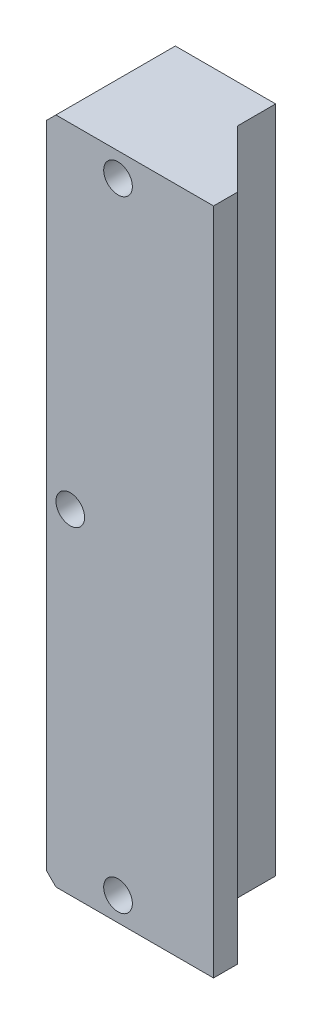
ISO-10303-21;
HEADER;
FILE_DESCRIPTION(('STEP AP214'),'2;1');
FILE_NAME('part.step','',(''),(''),'','','');
FILE_SCHEMA(('AUTOMOTIVE_DESIGN { 1 0 10303 214 1 1 1 1 }'));
ENDSEC;
DATA;
#1=APPLICATION_CONTEXT('core data for automotive mechanical design processes');
#2=APPLICATION_PROTOCOL_DEFINITION('international standard','automotive_design',2000,#1);
#3=PRODUCT_CONTEXT('',#1,'mechanical');
#4=PRODUCT('Part','Part','',(#3));
#5=PRODUCT_RELATED_PRODUCT_CATEGORY('part','',(#4));
#6=PRODUCT_DEFINITION_FORMATION('','',#4);
#7=PRODUCT_DEFINITION_CONTEXT('part definition',#1,'design');
#8=PRODUCT_DEFINITION('design','',#6,#7);
#9=PRODUCT_DEFINITION_SHAPE('','',#8);
#10=(LENGTH_UNIT() NAMED_UNIT(*) SI_UNIT(.MILLI.,.METRE.));
#11=(NAMED_UNIT(*) PLANE_ANGLE_UNIT() SI_UNIT($,.RADIAN.));
#12=(NAMED_UNIT(*) SI_UNIT($,.STERADIAN.) SOLID_ANGLE_UNIT());
#13=UNCERTAINTY_MEASURE_WITH_UNIT(LENGTH_MEASURE(1.E-05),#10,'distance_accuracy_value','');
#14=(GEOMETRIC_REPRESENTATION_CONTEXT(3) GLOBAL_UNCERTAINTY_ASSIGNED_CONTEXT((#13)) GLOBAL_UNIT_ASSIGNED_CONTEXT((#10,
#11,#12)) REPRESENTATION_CONTEXT('',''));
#15=CARTESIAN_POINT('',(0.,0.,0.));
#16=DIRECTION('',(0.,0.,1.));
#17=DIRECTION('',(1.,0.,0.));
#18=AXIS2_PLACEMENT_3D('',#15,#16,#17);
#19=CARTESIAN_POINT('',(17.5,70.,25.));
#20=DIRECTION('',(-1.,0.,0.));
#21=DIRECTION('',(0.,0.,1.));
#22=AXIS2_PLACEMENT_3D('',#19,#20,#21);
#23=PLANE('',#22);
#24=DIRECTION('',(0.,0.,-1.));
#25=VECTOR('',#24,1.);
#26=CARTESIAN_POINT('',(17.5,-70.,25.));
#27=LINE('',#26,#25);
#28=CARTESIAN_POINT('',(17.5,-70.,25.));
#29=VERTEX_POINT('',#28);
#30=CARTESIAN_POINT('',(17.5,-70.,20.));
#31=VERTEX_POINT('',#30);
#32=EDGE_CURVE('E125',#29,#31,#27,.T.);
#33=ORIENTED_EDGE('',*,*,#32,.T.);
#34=DIRECTION('',(0.,1.,0.));
#35=VECTOR('',#34,1.);
#36=CARTESIAN_POINT('',(17.5000000000003,-428.07273144846,20.));
#37=LINE('',#36,#35);
#38=CARTESIAN_POINT('',(17.4999999999999,70.,20.));
#39=VERTEX_POINT('',#38);
#40=EDGE_CURVE('E110',#31,#39,#37,.T.);
#41=ORIENTED_EDGE('',*,*,#40,.T.);
#42=DIRECTION('',(0.,0.,-1.));
#43=VECTOR('',#42,1.);
#44=CARTESIAN_POINT('',(17.5,70.,25.));
#45=LINE('',#44,#43);
#46=CARTESIAN_POINT('',(17.5,70.,25.));
#47=VERTEX_POINT('',#46);
#48=EDGE_CURVE('E123',#47,#39,#45,.T.);
#49=ORIENTED_EDGE('',*,*,#48,.F.);
#50=DIRECTION('',(0.,1.,0.));
#51=VECTOR('',#50,1.);
#52=CARTESIAN_POINT('',(17.5,70.,25.));
#53=LINE('',#52,#51);
#54=EDGE_CURVE('E174',#29,#47,#53,.T.);
#55=ORIENTED_EDGE('',*,*,#54,.F.);
#56=EDGE_LOOP('',(#33,#41,#49,#55));
#57=FACE_BOUND('',#56,.T.);
#58=ADVANCED_FACE('F40',(#57),#23,.F.);
#59=CARTESIAN_POINT('',(17.5,70.,25.));
#60=DIRECTION('',(0.,-1.,0.));
#61=DIRECTION('',(1.,0.,0.));
#62=AXIS2_PLACEMENT_3D('',#59,#60,#61);
#63=PLANE('',#62);
#64=DIRECTION('',(-1.,0.,0.));
#65=VECTOR('',#64,1.);
#66=CARTESIAN_POINT('',(17.5,70.,0.));
#67=LINE('',#66,#65);
#68=CARTESIAN_POINT('',(5.49999999999989,70.,0.));
#69=VERTEX_POINT('',#68);
#70=CARTESIAN_POINT('',(-15.5,70.,0.));
#71=VERTEX_POINT('',#70);
#72=EDGE_CURVE('E172',#69,#71,#67,.T.);
#73=ORIENTED_EDGE('',*,*,#72,.T.);
#74=DIRECTION('',(0.,0.,1.));
#75=VECTOR('',#74,1.);
#76=CARTESIAN_POINT('',(-15.5,70.,25.));
#77=LINE('',#76,#75);
#78=CARTESIAN_POINT('',(-15.5,70.,25.));
#79=VERTEX_POINT('',#78);
#80=EDGE_CURVE('E11',#71,#79,#77,.T.);
#81=ORIENTED_EDGE('',*,*,#80,.T.);
#82=DIRECTION('',(-1.,0.,0.));
#83=VECTOR('',#82,1.);
#84=CARTESIAN_POINT('',(17.5,70.,25.));
#85=LINE('',#84,#83);
#86=EDGE_CURVE('E128',#47,#79,#85,.T.);
#87=ORIENTED_EDGE('',*,*,#86,.F.);
#88=ORIENTED_EDGE('',*,*,#48,.T.);
#89=DIRECTION('',(-0.707106781186549,0.,-0.707106781186546));
#90=VECTOR('',#89,1.);
#91=CARTESIAN_POINT('',(19.9999999999999,70.,22.5));
#92=LINE('',#91,#90);
#93=CARTESIAN_POINT('',(5.49999999999989,70.,8.00000000000005));
#94=VERTEX_POINT('',#93);
#95=EDGE_CURVE('E107',#39,#94,#92,.T.);
#96=ORIENTED_EDGE('',*,*,#95,.T.);
#97=DIRECTION('',(0.,0.,-1.));
#98=VECTOR('',#97,1.);
#99=CARTESIAN_POINT('',(5.49999999999989,70.,25.));
#100=LINE('',#99,#98);
#101=EDGE_CURVE('E116',#94,#69,#100,.T.);
#102=ORIENTED_EDGE('',*,*,#101,.T.);
#103=EDGE_LOOP('',(#73,#81,#87,#88,#96,#102));
#104=FACE_BOUND('',#103,.T.);
#105=ADVANCED_FACE('F127',(#104),#63,.F.);
#106=CARTESIAN_POINT('',(-17.5,70.,25.));
#107=DIRECTION('',(1.,0.,0.));
#108=DIRECTION('',(0.,1.,0.));
#109=AXIS2_PLACEMENT_3D('',#106,#107,#108);
#110=PLANE('',#109);
#111=DIRECTION('',(0.,-1.,0.));
#112=VECTOR('',#111,1.);
#113=CARTESIAN_POINT('',(-17.5,70.,0.));
#114=LINE('',#113,#112);
#115=CARTESIAN_POINT('',(-17.5,68.,0.));
#116=VERTEX_POINT('',#115);
#117=CARTESIAN_POINT('',(-17.5,-68.,0.));
#118=VERTEX_POINT('',#117);
#119=EDGE_CURVE('E167',#116,#118,#114,.T.);
#120=ORIENTED_EDGE('',*,*,#119,.T.);
#121=DIRECTION('',(0.,0.,1.));
#122=VECTOR('',#121,1.);
#123=CARTESIAN_POINT('',(-17.5,-68.,25.));
#124=LINE('',#123,#122);
#125=CARTESIAN_POINT('',(-17.5,-68.,25.));
#126=VERTEX_POINT('',#125);
#127=EDGE_CURVE('E62',#118,#126,#124,.T.);
#128=ORIENTED_EDGE('',*,*,#127,.T.);
#129=DIRECTION('',(0.,-1.,0.));
#130=VECTOR('',#129,1.);
#131=CARTESIAN_POINT('',(-17.5,70.,25.));
#132=LINE('',#131,#130);
#133=CARTESIAN_POINT('',(-17.5,68.,25.));
#134=VERTEX_POINT('',#133);
#135=EDGE_CURVE('E156',#134,#126,#132,.T.);
#136=ORIENTED_EDGE('',*,*,#135,.F.);
#137=DIRECTION('',(0.,0.,-1.));
#138=VECTOR('',#137,1.);
#139=CARTESIAN_POINT('',(-17.5,68.,25.));
#140=LINE('',#139,#138);
#141=EDGE_CURVE('E147',#134,#116,#140,.T.);
#142=ORIENTED_EDGE('',*,*,#141,.T.);
#143=EDGE_LOOP('',(#120,#128,#136,#142));
#144=FACE_BOUND('',#143,.T.);
#145=ADVANCED_FACE('F170',(#144),#110,.F.);
#146=CARTESIAN_POINT('',(17.5,-70.,25.));
#147=DIRECTION('',(0.,1.,0.));
#148=DIRECTION('',(0.,0.,1.));
#149=AXIS2_PLACEMENT_3D('',#146,#147,#148);
#150=PLANE('',#149);
#151=DIRECTION('',(1.,0.,0.));
#152=VECTOR('',#151,1.);
#153=CARTESIAN_POINT('',(17.5,-70.,25.));
#154=LINE('',#153,#152);
#155=CARTESIAN_POINT('',(-15.5,-70.,25.));
#156=VERTEX_POINT('',#155);
#157=EDGE_CURVE('E134',#156,#29,#154,.T.);
#158=ORIENTED_EDGE('',*,*,#157,.F.);
#159=DIRECTION('',(0.,0.,-1.));
#160=VECTOR('',#159,1.);
#161=CARTESIAN_POINT('',(-15.5,-70.,25.));
#162=LINE('',#161,#160);
#163=CARTESIAN_POINT('',(-15.5,-70.,0.));
#164=VERTEX_POINT('',#163);
#165=EDGE_CURVE('E140',#156,#164,#162,.T.);
#166=ORIENTED_EDGE('',*,*,#165,.T.);
#167=DIRECTION('',(1.,0.,0.));
#168=VECTOR('',#167,1.);
#169=CARTESIAN_POINT('',(17.5,-70.,0.));
#170=LINE('',#169,#168);
#171=CARTESIAN_POINT('',(5.50000000000001,-70.,0.));
#172=VERTEX_POINT('',#171);
#173=EDGE_CURVE('E169',#164,#172,#170,.T.);
#174=ORIENTED_EDGE('',*,*,#173,.T.);
#175=DIRECTION('',(0.,0.,1.));
#176=VECTOR('',#175,1.);
#177=CARTESIAN_POINT('',(5.50000000000001,-70.,25.));
#178=LINE('',#177,#176);
#179=CARTESIAN_POINT('',(5.50000000000001,-70.,8.00000000000005));
#180=VERTEX_POINT('',#179);
#181=EDGE_CURVE('E132',#172,#180,#178,.T.);
#182=ORIENTED_EDGE('',*,*,#181,.T.);
#183=DIRECTION('',(0.707106781186549,0.,0.707106781186546));
#184=VECTOR('',#183,1.);
#185=CARTESIAN_POINT('',(20.,-70.,22.5));
#186=LINE('',#185,#184);
#187=EDGE_CURVE('E130',#180,#31,#186,.T.);
#188=ORIENTED_EDGE('',*,*,#187,.T.);
#189=ORIENTED_EDGE('',*,*,#32,.F.);
#190=EDGE_LOOP('',(#158,#166,#174,#182,#188,#189));
#191=FACE_BOUND('',#190,.T.);
#192=ADVANCED_FACE('F160',(#191),#150,.F.);
#193=CARTESIAN_POINT('',(0.,0.,25.));
#194=DIRECTION('',(0.,0.,-1.));
#195=DIRECTION('',(-1.,0.,0.));
#196=AXIS2_PLACEMENT_3D('',#193,#194,#195);
#197=PLANE('',#196);
#198=CARTESIAN_POINT('',(-2.50000000000003,65.,25.));
#199=DIRECTION('',(0.,0.,1.));
#200=DIRECTION('',(1.,0.,0.));
#201=AXIS2_PLACEMENT_3D('',#198,#199,#200);
#202=CIRCLE('',#201,3.);
#203=CARTESIAN_POINT('',(0.499999999999966,65.,25.));
#204=VERTEX_POINT('',#203);
#205=EDGE_CURVE('E216',#204,#204,#202,.T.);
#206=ORIENTED_EDGE('',*,*,#205,.F.);
#207=EDGE_LOOP('',(#206));
#208=FACE_BOUND('',#207,.T.);
#209=CARTESIAN_POINT('',(-12.5,0.,25.));
#210=DIRECTION('',(0.,0.,1.));
#211=DIRECTION('',(1.,0.,0.));
#212=AXIS2_PLACEMENT_3D('',#209,#210,#211);
#213=CIRCLE('',#212,3.);
#214=CARTESIAN_POINT('',(-9.50000000000002,0.,25.));
#215=VERTEX_POINT('',#214);
#216=EDGE_CURVE('E204',#215,#215,#213,.T.);
#217=ORIENTED_EDGE('',*,*,#216,.F.);
#218=EDGE_LOOP('',(#217));
#219=FACE_BOUND('',#218,.T.);
#220=CARTESIAN_POINT('',(-2.50000000000003,-65.,25.));
#221=DIRECTION('',(0.,0.,1.));
#222=DIRECTION('',(1.,0.,0.));
#223=AXIS2_PLACEMENT_3D('',#220,#221,#222);
#224=CIRCLE('',#223,3.);
#225=CARTESIAN_POINT('',(0.499999999999966,-65.,25.));
#226=VERTEX_POINT('',#225);
#227=EDGE_CURVE('E192',#226,#226,#224,.T.);
#228=ORIENTED_EDGE('',*,*,#227,.F.);
#229=EDGE_LOOP('',(#228));
#230=FACE_BOUND('',#229,.T.);
#231=ORIENTED_EDGE('',*,*,#135,.T.);
#232=DIRECTION('',(-0.707106781186545,0.70710678118655,0.));
#233=VECTOR('',#232,1.);
#234=CARTESIAN_POINT('',(-15.5,-70.,25.));
#235=LINE('',#234,#233);
#236=EDGE_CURVE('E49',#126,#156,#235,.F.);
#237=ORIENTED_EDGE('',*,*,#236,.T.);
#238=ORIENTED_EDGE('',*,*,#157,.T.);
#239=ORIENTED_EDGE('',*,*,#54,.T.);
#240=ORIENTED_EDGE('',*,*,#86,.T.);
#241=DIRECTION('',(0.707106781186545,0.70710678118655,0.));
#242=VECTOR('',#241,1.);
#243=CARTESIAN_POINT('',(-17.5,68.,25.));
#244=LINE('',#243,#242);
#245=EDGE_CURVE('E151',#79,#134,#244,.F.);
#246=ORIENTED_EDGE('',*,*,#245,.T.);
#247=EDGE_LOOP('',(#231,#237,#238,#239,#240,#246));
#248=FACE_BOUND('',#247,.T.);
#249=ADVANCED_FACE('F155',(#208,#219,#230,#248),#197,.F.);
#250=CARTESIAN_POINT('',(0.,0.,0.));
#251=DIRECTION('',(0.,0.,-1.));
#252=DIRECTION('',(-1.,0.,0.));
#253=AXIS2_PLACEMENT_3D('',#250,#251,#252);
#254=PLANE('',#253);
#255=CARTESIAN_POINT('',(-2.50000000000003,65.,0.));
#256=DIRECTION('',(0.,0.,1.));
#257=DIRECTION('',(1.,0.,0.));
#258=AXIS2_PLACEMENT_3D('',#255,#256,#257);
#259=CIRCLE('',#258,1.59999999999999);
#260=CARTESIAN_POINT('',(-0.900000000000036,65.,0.));
#261=VERTEX_POINT('',#260);
#262=EDGE_CURVE('E207',#261,#261,#259,.T.);
#263=ORIENTED_EDGE('',*,*,#262,.T.);
#264=EDGE_LOOP('',(#263));
#265=FACE_BOUND('',#264,.T.);
#266=CARTESIAN_POINT('',(-12.5,0.,0.));
#267=DIRECTION('',(0.,0.,1.));
#268=DIRECTION('',(1.,0.,0.));
#269=AXIS2_PLACEMENT_3D('',#266,#267,#268);
#270=CIRCLE('',#269,1.59999999999999);
#271=CARTESIAN_POINT('',(-10.9,0.,0.));
#272=VERTEX_POINT('',#271);
#273=EDGE_CURVE('E195',#272,#272,#270,.T.);
#274=ORIENTED_EDGE('',*,*,#273,.T.);
#275=EDGE_LOOP('',(#274));
#276=FACE_BOUND('',#275,.T.);
#277=CARTESIAN_POINT('',(-2.50000000000003,-65.,0.));
#278=DIRECTION('',(0.,0.,1.));
#279=DIRECTION('',(1.,0.,0.));
#280=AXIS2_PLACEMENT_3D('',#277,#278,#279);
#281=CIRCLE('',#280,1.59999999999999);
#282=CARTESIAN_POINT('',(-0.900000000000036,-65.,0.));
#283=VERTEX_POINT('',#282);
#284=EDGE_CURVE('E182',#283,#283,#281,.T.);
#285=ORIENTED_EDGE('',*,*,#284,.T.);
#286=EDGE_LOOP('',(#285));
#287=FACE_BOUND('',#286,.T.);
#288=ORIENTED_EDGE('',*,*,#173,.F.);
#289=DIRECTION('',(0.707106781186545,-0.70710678118655,0.));
#290=VECTOR('',#289,1.);
#291=CARTESIAN_POINT('',(-42.7500000000001,-42.7499999999998,0.));
#292=LINE('',#291,#290);
#293=EDGE_CURVE('E145',#164,#118,#292,.F.);
#294=ORIENTED_EDGE('',*,*,#293,.T.);
#295=ORIENTED_EDGE('',*,*,#119,.F.);
#296=DIRECTION('',(-0.707106781186545,-0.70710678118655,0.));
#297=VECTOR('',#296,1.);
#298=CARTESIAN_POINT('',(-42.75,42.7499999999998,0.));
#299=LINE('',#298,#297);
#300=EDGE_CURVE('E143',#116,#71,#299,.F.);
#301=ORIENTED_EDGE('',*,*,#300,.T.);
#302=ORIENTED_EDGE('',*,*,#72,.F.);
#303=DIRECTION('',(0.,1.,0.));
#304=VECTOR('',#303,1.);
#305=CARTESIAN_POINT('',(5.50000000000029,-428.07273144846,0.));
#306=LINE('',#305,#304);
#307=EDGE_CURVE('E117',#172,#69,#306,.T.);
#308=ORIENTED_EDGE('',*,*,#307,.F.);
#309=EDGE_LOOP('',(#288,#294,#295,#301,#302,#308));
#310=FACE_BOUND('',#309,.T.);
#311=ADVANCED_FACE('F166',(#265,#276,#287,#310),#254,.T.);
#312=CARTESIAN_POINT('',(5.50000000000029,-428.07273144846,0.));
#313=DIRECTION('',(-1.,0.,0.));
#314=DIRECTION('',(0.,-1.,0.));
#315=AXIS2_PLACEMENT_3D('',#312,#313,#314);
#316=PLANE('',#315);
#317=ORIENTED_EDGE('',*,*,#101,.F.);
#318=DIRECTION('',(0.,1.,0.));
#319=VECTOR('',#318,1.);
#320=CARTESIAN_POINT('',(5.50000000000029,-428.07273144846,8.00000000000005));
#321=LINE('',#320,#319);
#322=EDGE_CURVE('E113',#180,#94,#321,.T.);
#323=ORIENTED_EDGE('',*,*,#322,.F.);
#324=ORIENTED_EDGE('',*,*,#181,.F.);
#325=ORIENTED_EDGE('',*,*,#307,.T.);
#326=EDGE_LOOP('',(#317,#323,#324,#325));
#327=FACE_BOUND('',#326,.T.);
#328=ADVANCED_FACE('F350',(#327),#316,.F.);
#329=CARTESIAN_POINT('',(5.50000000000029,-428.07273144846,8.00000000000005));
#330=DIRECTION('',(-0.707106781186546,0.,0.707106781186549));
#331=DIRECTION('',(0.707106781186549,0.,0.707106781186546));
#332=AXIS2_PLACEMENT_3D('',#329,#330,#331);
#333=PLANE('',#332);
#334=ORIENTED_EDGE('',*,*,#95,.F.);
#335=ORIENTED_EDGE('',*,*,#40,.F.);
#336=ORIENTED_EDGE('',*,*,#187,.F.);
#337=ORIENTED_EDGE('',*,*,#322,.T.);
#338=EDGE_LOOP('',(#334,#335,#336,#337));
#339=FACE_BOUND('',#338,.T.);
#340=ADVANCED_FACE('F109',(#339),#333,.F.);
#341=CARTESIAN_POINT('',(-2.50000000000003,-65.,25.));
#342=DIRECTION('',(0.,0.,1.));
#343=DIRECTION('',(1.,0.,0.));
#344=AXIS2_PLACEMENT_3D('',#341,#342,#343);
#345=CYLINDRICAL_SURFACE('',#344,1.6);
#346=ORIENTED_EDGE('',*,*,#284,.F.);
#347=EDGE_LOOP('',(#346));
#348=FACE_BOUND('',#347,.T.);
#349=CARTESIAN_POINT('',(-2.50000000000003,-65.,6.6));
#350=DIRECTION('',(0.,0.,1.));
#351=DIRECTION('',(1.,0.,0.));
#352=AXIS2_PLACEMENT_3D('',#349,#350,#351);
#353=CIRCLE('',#352,1.6);
#354=CARTESIAN_POINT('',(-0.900000000000033,-65.,6.6));
#355=VERTEX_POINT('',#354);
#356=EDGE_CURVE('E186',#355,#355,#353,.T.);
#357=ORIENTED_EDGE('',*,*,#356,.T.);
#358=EDGE_LOOP('',(#357));
#359=FACE_BOUND('',#358,.T.);
#360=ADVANCED_FACE('F242',(#348,#359),#345,.F.);
#361=CARTESIAN_POINT('',(-0.900000000000033,-65.,6.6));
#362=DIRECTION('',(0.,0.,-1.));
#363=DIRECTION('',(-1.,0.,0.));
#364=AXIS2_PLACEMENT_3D('',#361,#362,#363);
#365=PLANE('',#364);
#366=ORIENTED_EDGE('',*,*,#356,.F.);
#367=EDGE_LOOP('',(#366));
#368=FACE_BOUND('',#367,.T.);
#369=CARTESIAN_POINT('',(-2.50000000000003,-65.,6.6));
#370=DIRECTION('',(0.,0.,1.));
#371=DIRECTION('',(1.,0.,0.));
#372=AXIS2_PLACEMENT_3D('',#369,#370,#371);
#373=CIRCLE('',#372,3.);
#374=CARTESIAN_POINT('',(0.499999999999967,-65.,6.6));
#375=VERTEX_POINT('',#374);
#376=EDGE_CURVE('E189',#375,#375,#373,.T.);
#377=ORIENTED_EDGE('',*,*,#376,.T.);
#378=EDGE_LOOP('',(#377));
#379=FACE_BOUND('',#378,.T.);
#380=ADVANCED_FACE('F232',(#368,#379),#365,.F.);
#381=CARTESIAN_POINT('',(-2.50000000000003,-65.,25.));
#382=DIRECTION('',(0.,0.,1.));
#383=DIRECTION('',(1.,0.,0.));
#384=AXIS2_PLACEMENT_3D('',#381,#382,#383);
#385=CYLINDRICAL_SURFACE('',#384,3.);
#386=ORIENTED_EDGE('',*,*,#376,.F.);
#387=EDGE_LOOP('',(#386));
#388=FACE_BOUND('',#387,.T.);
#389=ORIENTED_EDGE('',*,*,#227,.T.);
#390=EDGE_LOOP('',(#389));
#391=FACE_BOUND('',#390,.T.);
#392=ADVANCED_FACE('F229',(#388,#391),#385,.F.);
#393=CARTESIAN_POINT('',(-12.5,0.,25.));
#394=DIRECTION('',(0.,0.,1.));
#395=DIRECTION('',(1.,0.,0.));
#396=AXIS2_PLACEMENT_3D('',#393,#394,#395);
#397=CYLINDRICAL_SURFACE('',#396,1.6);
#398=ORIENTED_EDGE('',*,*,#273,.F.);
#399=EDGE_LOOP('',(#398));
#400=FACE_BOUND('',#399,.T.);
#401=CARTESIAN_POINT('',(-12.5,0.,6.6));
#402=DIRECTION('',(0.,0.,1.));
#403=DIRECTION('',(1.,0.,0.));
#404=AXIS2_PLACEMENT_3D('',#401,#402,#403);
#405=CIRCLE('',#404,1.6);
#406=CARTESIAN_POINT('',(-10.9,0.,6.6));
#407=VERTEX_POINT('',#406);
#408=EDGE_CURVE('E198',#407,#407,#405,.T.);
#409=ORIENTED_EDGE('',*,*,#408,.T.);
#410=EDGE_LOOP('',(#409));
#411=FACE_BOUND('',#410,.T.);
#412=ADVANCED_FACE('F231',(#400,#411),#397,.F.);
#413=CARTESIAN_POINT('',(-10.9,0.,6.6));
#414=DIRECTION('',(0.,0.,-1.));
#415=DIRECTION('',(-1.,0.,0.));
#416=AXIS2_PLACEMENT_3D('',#413,#414,#415);
#417=PLANE('',#416);
#418=ORIENTED_EDGE('',*,*,#408,.F.);
#419=EDGE_LOOP('',(#418));
#420=FACE_BOUND('',#419,.T.);
#421=CARTESIAN_POINT('',(-12.5,0.,6.6));
#422=DIRECTION('',(0.,0.,1.));
#423=DIRECTION('',(1.,0.,0.));
#424=AXIS2_PLACEMENT_3D('',#421,#422,#423);
#425=CIRCLE('',#424,3.);
#426=CARTESIAN_POINT('',(-9.50000000000002,0.,6.6));
#427=VERTEX_POINT('',#426);
#428=EDGE_CURVE('E201',#427,#427,#425,.T.);
#429=ORIENTED_EDGE('',*,*,#428,.T.);
#430=EDGE_LOOP('',(#429));
#431=FACE_BOUND('',#430,.T.);
#432=ADVANCED_FACE('F239',(#420,#431),#417,.F.);
#433=CARTESIAN_POINT('',(-12.5,0.,25.));
#434=DIRECTION('',(0.,0.,1.));
#435=DIRECTION('',(1.,0.,0.));
#436=AXIS2_PLACEMENT_3D('',#433,#434,#435);
#437=CYLINDRICAL_SURFACE('',#436,3.);
#438=ORIENTED_EDGE('',*,*,#428,.F.);
#439=EDGE_LOOP('',(#438));
#440=FACE_BOUND('',#439,.T.);
#441=ORIENTED_EDGE('',*,*,#216,.T.);
#442=EDGE_LOOP('',(#441));
#443=FACE_BOUND('',#442,.T.);
#444=ADVANCED_FACE('F275',(#440,#443),#437,.F.);
#445=CARTESIAN_POINT('',(-2.50000000000003,65.,25.));
#446=DIRECTION('',(0.,0.,1.));
#447=DIRECTION('',(1.,0.,0.));
#448=AXIS2_PLACEMENT_3D('',#445,#446,#447);
#449=CYLINDRICAL_SURFACE('',#448,1.6);
#450=ORIENTED_EDGE('',*,*,#262,.F.);
#451=EDGE_LOOP('',(#450));
#452=FACE_BOUND('',#451,.T.);
#453=CARTESIAN_POINT('',(-2.50000000000003,65.,6.6));
#454=DIRECTION('',(0.,0.,1.));
#455=DIRECTION('',(1.,0.,0.));
#456=AXIS2_PLACEMENT_3D('',#453,#454,#455);
#457=CIRCLE('',#456,1.6);
#458=CARTESIAN_POINT('',(-0.900000000000033,65.,6.6));
#459=VERTEX_POINT('',#458);
#460=EDGE_CURVE('E210',#459,#459,#457,.T.);
#461=ORIENTED_EDGE('',*,*,#460,.T.);
#462=EDGE_LOOP('',(#461));
#463=FACE_BOUND('',#462,.T.);
#464=ADVANCED_FACE('F268',(#452,#463),#449,.F.);
#465=CARTESIAN_POINT('',(-0.900000000000033,65.,6.6));
#466=DIRECTION('',(0.,0.,-1.));
#467=DIRECTION('',(-1.,0.,0.));
#468=AXIS2_PLACEMENT_3D('',#465,#466,#467);
#469=PLANE('',#468);
#470=ORIENTED_EDGE('',*,*,#460,.F.);
#471=EDGE_LOOP('',(#470));
#472=FACE_BOUND('',#471,.T.);
#473=CARTESIAN_POINT('',(-2.50000000000003,65.,6.6));
#474=DIRECTION('',(0.,0.,1.));
#475=DIRECTION('',(1.,0.,0.));
#476=AXIS2_PLACEMENT_3D('',#473,#474,#475);
#477=CIRCLE('',#476,3.);
#478=CARTESIAN_POINT('',(0.499999999999967,65.,6.6));
#479=VERTEX_POINT('',#478);
#480=EDGE_CURVE('E213',#479,#479,#477,.T.);
#481=ORIENTED_EDGE('',*,*,#480,.T.);
#482=EDGE_LOOP('',(#481));
#483=FACE_BOUND('',#482,.T.);
#484=ADVANCED_FACE('F262',(#472,#483),#469,.F.);
#485=CARTESIAN_POINT('',(-2.50000000000003,65.,25.));
#486=DIRECTION('',(0.,0.,1.));
#487=DIRECTION('',(1.,0.,0.));
#488=AXIS2_PLACEMENT_3D('',#485,#486,#487);
#489=CYLINDRICAL_SURFACE('',#488,3.);
#490=ORIENTED_EDGE('',*,*,#480,.F.);
#491=EDGE_LOOP('',(#490));
#492=FACE_BOUND('',#491,.T.);
#493=ORIENTED_EDGE('',*,*,#205,.T.);
#494=EDGE_LOOP('',(#493));
#495=FACE_BOUND('',#494,.T.);
#496=ADVANCED_FACE('F220',(#492,#495),#489,.F.);
#497=CARTESIAN_POINT('',(-15.5,-70.,25.));
#498=DIRECTION('',(0.70710678118655,0.707106781186545,0.));
#499=DIRECTION('',(0.,0.,-1.));
#500=AXIS2_PLACEMENT_3D('',#497,#498,#499);
#501=PLANE('',#500);
#502=ORIENTED_EDGE('',*,*,#236,.F.);
#503=ORIENTED_EDGE('',*,*,#127,.F.);
#504=ORIENTED_EDGE('',*,*,#293,.F.);
#505=ORIENTED_EDGE('',*,*,#165,.F.);
#506=EDGE_LOOP('',(#502,#503,#504,#505));
#507=FACE_BOUND('',#506,.T.);
#508=ADVANCED_FACE('F163',(#507),#501,.F.);
#509=CARTESIAN_POINT('',(-17.5,68.,25.));
#510=DIRECTION('',(0.70710678118655,-0.707106781186545,0.));
#511=DIRECTION('',(0.,0.,-1.));
#512=AXIS2_PLACEMENT_3D('',#509,#510,#511);
#513=PLANE('',#512);
#514=ORIENTED_EDGE('',*,*,#245,.F.);
#515=ORIENTED_EDGE('',*,*,#80,.F.);
#516=ORIENTED_EDGE('',*,*,#300,.F.);
#517=ORIENTED_EDGE('',*,*,#141,.F.);
#518=EDGE_LOOP('',(#514,#515,#516,#517));
#519=FACE_BOUND('',#518,.T.);
#520=ADVANCED_FACE('F43',(#519),#513,.F.);
#521=CLOSED_SHELL('',(#58,#105,#145,#192,#249,#311,#328,#340,#360,#380,#392,#412,#432,#444,#464,
#484,#496,#508,#520));
#522=MANIFOLD_SOLID_BREP('B2',#521);
#523=ADVANCED_BREP_SHAPE_REPRESENTATION('',(#18,#522),#14);
#524=SHAPE_DEFINITION_REPRESENTATION(#9,#523);
ENDSEC;
END-ISO-10303-21;
